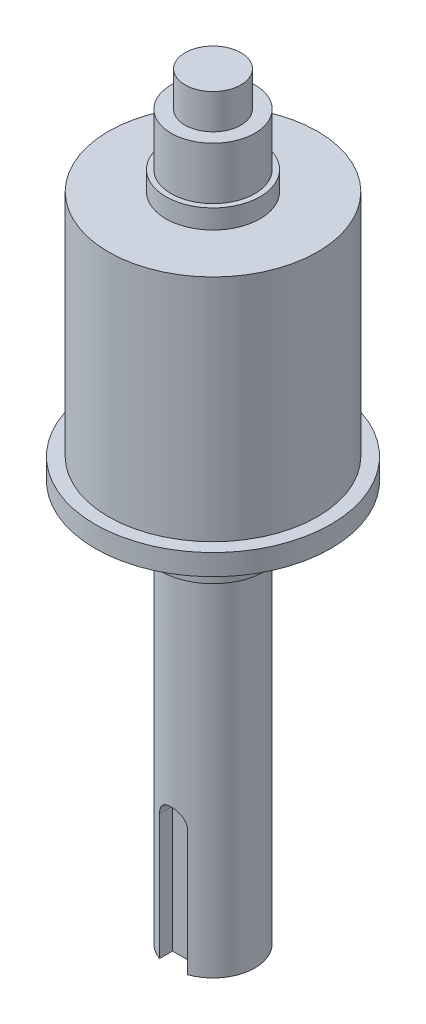
ISO-10303-21;
HEADER;
FILE_DESCRIPTION(('STEP AP214'),'2;1');
FILE_NAME('part.step','',(''),(''),'','','');
FILE_SCHEMA(('AUTOMOTIVE_DESIGN { 1 0 10303 214 1 1 1 1 }'));
ENDSEC;
DATA;
#1=APPLICATION_CONTEXT('core data for automotive mechanical design processes');
#2=APPLICATION_PROTOCOL_DEFINITION('international standard','automotive_design',2000,#1);
#3=PRODUCT_CONTEXT('',#1,'mechanical');
#4=PRODUCT('Part','Part','',(#3));
#5=PRODUCT_RELATED_PRODUCT_CATEGORY('part','',(#4));
#6=PRODUCT_DEFINITION_FORMATION('','',#4);
#7=PRODUCT_DEFINITION_CONTEXT('part definition',#1,'design');
#8=PRODUCT_DEFINITION('design','',#6,#7);
#9=PRODUCT_DEFINITION_SHAPE('','',#8);
#10=(LENGTH_UNIT() NAMED_UNIT(*) SI_UNIT(.MILLI.,.METRE.));
#11=(NAMED_UNIT(*) PLANE_ANGLE_UNIT() SI_UNIT($,.RADIAN.));
#12=(NAMED_UNIT(*) SI_UNIT($,.STERADIAN.) SOLID_ANGLE_UNIT());
#13=UNCERTAINTY_MEASURE_WITH_UNIT(LENGTH_MEASURE(1.E-05),#10,'distance_accuracy_value','');
#14=(GEOMETRIC_REPRESENTATION_CONTEXT(3) GLOBAL_UNCERTAINTY_ASSIGNED_CONTEXT((#13)) GLOBAL_UNIT_ASSIGNED_CONTEXT((#10,
#11,#12)) REPRESENTATION_CONTEXT('',''));
#15=CARTESIAN_POINT('',(0.,0.,0.));
#16=DIRECTION('',(0.,0.,1.));
#17=DIRECTION('',(1.,0.,0.));
#18=AXIS2_PLACEMENT_3D('',#15,#16,#17);
#19=CARTESIAN_POINT('',(0.,40.0334496894889,0.));
#20=DIRECTION('',(0.,1.,0.));
#21=DIRECTION('',(0.,0.,1.));
#22=AXIS2_PLACEMENT_3D('',#19,#20,#21);
#23=CYLINDRICAL_SURFACE('',#22,6.);
#24=CARTESIAN_POINT('',(0.,-58.61,0.));
#25=DIRECTION('',(0.,1.,0.));
#26=DIRECTION('',(0.,0.,1.));
#27=AXIS2_PLACEMENT_3D('',#24,#25,#26);
#28=CIRCLE('',#27,6.);
#29=CARTESIAN_POINT('',(0.,-58.61,6.));
#30=VERTEX_POINT('',#29);
#31=EDGE_CURVE('E119',#30,#30,#28,.T.);
#32=ORIENTED_EDGE('',*,*,#31,.F.);
#33=EDGE_LOOP('',(#32));
#34=FACE_BOUND('',#33,.T.);
#35=CARTESIAN_POINT('',(-2.,-90.61,5.65685424949238));
#36=CARTESIAN_POINT('',(-2.0000014949184,-90.5554190063978,5.65684884188677));
#37=CARTESIAN_POINT('',(-1.99776424917478,-90.5008658756214,5.6576451988649));
#38=CARTESIAN_POINT('',(-1.9888512140728,-90.3921828318902,5.66078654578441));
#39=CARTESIAN_POINT('',(-1.98217662286705,-90.3380528086806,5.66313111768244));
#40=CARTESIAN_POINT('',(-1.95562135046158,-90.1772157136097,5.67238184449301));
#41=CARTESIAN_POINT('',(-1.92920846605623,-90.0716383074591,5.6815058499903));
#42=CARTESIAN_POINT('',(-1.85991682366086,-89.8667496151125,5.70456149397718));
#43=CARTESIAN_POINT('',(-1.81704715197507,-89.7674349062542,5.71849047905858));
#44=CARTESIAN_POINT('',(-1.71614645792974,-89.5773203319891,5.74957574438921));
#45=CARTESIAN_POINT('',(-1.65810612564547,-89.4865257418653,5.76673400456216));
#46=CARTESIAN_POINT('',(-1.52610278704603,-89.3125595373509,5.80308960804095));
#47=CARTESIAN_POINT('',(-1.45164996064407,-89.2297702390748,5.82233755536617));
#48=CARTESIAN_POINT('',(-1.28997688598297,-89.0775879644166,5.86027697385955));
#49=CARTESIAN_POINT('',(-1.20275436910907,-89.0081973734881,5.87896834543705));
#50=CARTESIAN_POINT('',(-1.01520729191253,-88.8830409623916,5.91427765988454));
#51=CARTESIAN_POINT('',(-0.914600178716996,-88.8276780311955,5.93082875123707));
#52=CARTESIAN_POINT('',(-0.704858499931721,-88.7348154966255,5.95939217209316));
#53=CARTESIAN_POINT('',(-0.595726551186841,-88.6973104363591,5.97140588786619));
#54=CARTESIAN_POINT('',(-0.376058690956074,-88.6425285478173,5.98918142285845));
#55=CARTESIAN_POINT('',(-0.265703668920225,-88.6245934548926,5.99514617977146));
#56=CARTESIAN_POINT('',(-0.0433979389113498,-88.6073674029488,6.00087216807633));
#57=CARTESIAN_POINT('',(0.0685523824907803,-88.6080720014605,6.00063487762604));
#58=CARTESIAN_POINT('',(0.286207690558779,-88.6276885662133,5.99412077270531));
#59=CARTESIAN_POINT('',(0.391985405251067,-88.6458852759189,5.98808121982527));
#60=CARTESIAN_POINT('',(0.598888128753307,-88.6987863973482,5.97093921001647));
#61=CARTESIAN_POINT('',(0.700012879232924,-88.7334917244125,5.95983647235462));
#62=CARTESIAN_POINT('',(0.89630524606192,-88.8188427392013,5.93351336542608));
#63=CARTESIAN_POINT('',(0.991377011307978,-88.8696920902447,5.91824075676625));
#64=CARTESIAN_POINT('',(1.17184917819497,-88.9857199027814,5.88516775360088));
#65=CARTESIAN_POINT('',(1.25724693942937,-89.050902262093,5.86736667195186));
#66=CARTESIAN_POINT('',(1.42019467942242,-89.1973420999937,5.83012543885479));
#67=CARTESIAN_POINT('',(1.49718722322539,-89.2792110872194,5.81064757359828));
#68=CARTESIAN_POINT('',(1.63654404964076,-89.4548829794323,5.77294980945702));
#69=CARTESIAN_POINT('',(1.69890360636762,-89.5486897248065,5.75473031831506));
#70=CARTESIAN_POINT('',(1.80800665118557,-89.7473603567066,5.72140062752635));
#71=CARTESIAN_POINT('',(1.85450601901537,-89.8523670298659,5.70634029896469));
#72=CARTESIAN_POINT('',(1.92892046140224,-90.0692939551799,5.68162194124078));
#73=CARTESIAN_POINT('',(1.95686487211071,-90.1812029867443,5.67195538817985));
#74=CARTESIAN_POINT('',(1.98331631256166,-90.346837273496,5.6627308418944));
#75=CARTESIAN_POINT('',(1.98957012251023,-90.3992827797084,5.66053335389203));
#76=CARTESIAN_POINT('',(1.99790923214239,-90.5044761567996,5.65759407142798));
#77=CARTESIAN_POINT('',(1.99999991078996,-90.5572235490888,5.65685039859056));
#78=CARTESIAN_POINT('',(2.,-90.61,5.65685424949238));
#79=B_SPLINE_CURVE_WITH_KNOTS('',3,(#35,#36,#37,#38,#39,#40,#41,#42,#43,#44,#45,#46,#47,#48,#49,
#50,#51,#52,#53,#54,#55,#56,#57,#58,#59,#60,#61,#62,#63,#64,#65,#66,#67,#68,#69,#70,#71,#72,#73,
#74,#75,#76,#77,#78),.UNSPECIFIED.,.F.,.F.,(4,2,2,2,2,2,2,2,2,2,2,2,2,2,2,2,2,2,2,2,2,4),(0.,
0.163636969470853,0.327229772338919,0.653162396790742,0.978915321932481,1.30486862627062,
1.64233009925354,1.97985159727494,2.32618265866202,2.67240782242254,3.00658941454805,
3.34069136061284,3.66168836931469,3.98270317816495,4.30794037651934,4.63326613177536,
4.97388108116099,5.31460588498485,5.66036059856081,6.00556734973678,6.163997906655,
6.32222363058113),.UNSPECIFIED.);
#80=CARTESIAN_POINT('',(-2.,-90.61,5.65685424949238));
#81=VERTEX_POINT('',#80);
#82=CARTESIAN_POINT('',(2.,-90.61,5.65685424949238));
#83=VERTEX_POINT('',#82);
#84=EDGE_CURVE('E11',#81,#83,#79,.T.);
#85=ORIENTED_EDGE('',*,*,#84,.T.);
#86=DIRECTION('',(0.,-1.,0.));
#87=VECTOR('',#86,1.);
#88=CARTESIAN_POINT('',(2.,-93.61,5.65685424949237));
#89=LINE('',#88,#87);
#90=CARTESIAN_POINT('',(2.,-108.61,5.65685424949237));
#91=VERTEX_POINT('',#90);
#92=EDGE_CURVE('E94',#83,#91,#89,.T.);
#93=ORIENTED_EDGE('',*,*,#92,.T.);
#94=CARTESIAN_POINT('',(0.,-108.61,0.));
#95=DIRECTION('',(0.,1.,0.));
#96=DIRECTION('',(0.,0.,1.));
#97=AXIS2_PLACEMENT_3D('',#94,#95,#96);
#98=CIRCLE('',#97,5.99999999999999);
#99=CARTESIAN_POINT('',(-2.,-108.61,5.65685424949237));
#100=VERTEX_POINT('',#99);
#101=EDGE_CURVE('E113',#91,#100,#98,.T.);
#102=ORIENTED_EDGE('',*,*,#101,.T.);
#103=DIRECTION('',(0.,-1.,0.));
#104=VECTOR('',#103,1.);
#105=CARTESIAN_POINT('',(-2.,-93.61,5.65685424949237));
#106=LINE('',#105,#104);
#107=EDGE_CURVE('E60',#81,#100,#106,.T.);
#108=ORIENTED_EDGE('',*,*,#107,.F.);
#109=EDGE_LOOP('',(#85,#93,#102,#108));
#110=FACE_BOUND('',#109,.T.);
#111=ADVANCED_FACE('F39',(#34,#110),#23,.T.);
#112=CARTESIAN_POINT('',(0.,0.,0.));
#113=DIRECTION('',(0.,1.,0.));
#114=DIRECTION('',(0.,0.,1.));
#115=AXIS2_PLACEMENT_3D('',#112,#113,#114);
#116=PLANE('',#115);
#117=CARTESIAN_POINT('',(0.,0.,0.));
#118=DIRECTION('',(0.,1.,0.));
#119=DIRECTION('',(0.,0.,1.));
#120=AXIS2_PLACEMENT_3D('',#117,#118,#119);
#121=CIRCLE('',#120,4.);
#122=CARTESIAN_POINT('',(0.,0.,4.));
#123=VERTEX_POINT('',#122);
#124=EDGE_CURVE('E53',#123,#123,#121,.T.);
#125=ORIENTED_EDGE('',*,*,#124,.T.);
#126=EDGE_LOOP('',(#125));
#127=FACE_BOUND('',#126,.T.);
#128=ADVANCED_FACE('F41',(#127),#116,.T.);
#129=CARTESIAN_POINT('',(0.,40.0334496894889,0.));
#130=DIRECTION('',(0.,1.,0.));
#131=DIRECTION('',(0.,0.,1.));
#132=AXIS2_PLACEMENT_3D('',#129,#130,#131);
#133=CYLINDRICAL_SURFACE('',#132,4.);
#134=CARTESIAN_POINT('',(0.,-5.,0.));
#135=DIRECTION('',(0.,1.,0.));
#136=DIRECTION('',(0.,0.,1.));
#137=AXIS2_PLACEMENT_3D('',#134,#135,#136);
#138=CIRCLE('',#137,4.);
#139=CARTESIAN_POINT('',(0.,-5.,4.));
#140=VERTEX_POINT('',#139);
#141=EDGE_CURVE('E158',#140,#140,#138,.T.);
#142=ORIENTED_EDGE('',*,*,#141,.T.);
#143=EDGE_LOOP('',(#142));
#144=FACE_BOUND('',#143,.T.);
#145=ORIENTED_EDGE('',*,*,#124,.F.);
#146=EDGE_LOOP('',(#145));
#147=FACE_BOUND('',#146,.T.);
#148=ADVANCED_FACE('F164',(#144,#147),#133,.T.);
#149=CARTESIAN_POINT('',(-4.,-5.,0.));
#150=DIRECTION('',(0.,1.,0.));
#151=DIRECTION('',(0.,0.,1.));
#152=AXIS2_PLACEMENT_3D('',#149,#150,#151);
#153=PLANE('',#152);
#154=CARTESIAN_POINT('',(0.,-5.,0.));
#155=DIRECTION('',(0.,1.,0.));
#156=DIRECTION('',(0.,0.,1.));
#157=AXIS2_PLACEMENT_3D('',#154,#155,#156);
#158=CIRCLE('',#157,6.);
#159=CARTESIAN_POINT('',(0.,-5.,6.));
#160=VERTEX_POINT('',#159);
#161=EDGE_CURVE('E155',#160,#160,#158,.T.);
#162=ORIENTED_EDGE('',*,*,#161,.T.);
#163=EDGE_LOOP('',(#162));
#164=FACE_BOUND('',#163,.T.);
#165=ORIENTED_EDGE('',*,*,#141,.F.);
#166=EDGE_LOOP('',(#165));
#167=FACE_BOUND('',#166,.T.);
#168=ADVANCED_FACE('F166',(#164,#167),#153,.T.);
#169=CARTESIAN_POINT('',(0.,40.0334496894889,0.));
#170=DIRECTION('',(0.,1.,0.));
#171=DIRECTION('',(0.,0.,1.));
#172=AXIS2_PLACEMENT_3D('',#169,#170,#171);
#173=CYLINDRICAL_SURFACE('',#172,6.);
#174=CARTESIAN_POINT('',(0.,-12.5,0.));
#175=DIRECTION('',(0.,1.,0.));
#176=DIRECTION('',(0.,0.,1.));
#177=AXIS2_PLACEMENT_3D('',#174,#175,#176);
#178=CIRCLE('',#177,6.);
#179=CARTESIAN_POINT('',(0.,-12.5,6.));
#180=VERTEX_POINT('',#179);
#181=EDGE_CURVE('E152',#180,#180,#178,.T.);
#182=ORIENTED_EDGE('',*,*,#181,.T.);
#183=EDGE_LOOP('',(#182));
#184=FACE_BOUND('',#183,.T.);
#185=ORIENTED_EDGE('',*,*,#161,.F.);
#186=EDGE_LOOP('',(#185));
#187=FACE_BOUND('',#186,.T.);
#188=ADVANCED_FACE('F172',(#184,#187),#173,.T.);
#189=CARTESIAN_POINT('',(-6.,-12.5,0.));
#190=DIRECTION('',(0.,1.,0.));
#191=DIRECTION('',(0.,0.,1.));
#192=AXIS2_PLACEMENT_3D('',#189,#190,#191);
#193=PLANE('',#192);
#194=CARTESIAN_POINT('',(0.,-12.5,0.));
#195=DIRECTION('',(0.,1.,0.));
#196=DIRECTION('',(0.,0.,1.));
#197=AXIS2_PLACEMENT_3D('',#194,#195,#196);
#198=CIRCLE('',#197,6.75);
#199=CARTESIAN_POINT('',(0.,-12.5,6.75));
#200=VERTEX_POINT('',#199);
#201=EDGE_CURVE('E149',#200,#200,#198,.T.);
#202=ORIENTED_EDGE('',*,*,#201,.T.);
#203=EDGE_LOOP('',(#202));
#204=FACE_BOUND('',#203,.T.);
#205=ORIENTED_EDGE('',*,*,#181,.F.);
#206=EDGE_LOOP('',(#205));
#207=FACE_BOUND('',#206,.T.);
#208=ADVANCED_FACE('F225',(#204,#207),#193,.T.);
#209=CARTESIAN_POINT('',(0.,40.0334496894889,0.));
#210=DIRECTION('',(0.,1.,0.));
#211=DIRECTION('',(0.,0.,1.));
#212=AXIS2_PLACEMENT_3D('',#209,#210,#211);
#213=CYLINDRICAL_SURFACE('',#212,6.75);
#214=CARTESIAN_POINT('',(0.,-15.25,0.));
#215=DIRECTION('',(0.,1.,0.));
#216=DIRECTION('',(0.,0.,1.));
#217=AXIS2_PLACEMENT_3D('',#214,#215,#216);
#218=CIRCLE('',#217,6.75);
#219=CARTESIAN_POINT('',(0.,-15.25,6.75));
#220=VERTEX_POINT('',#219);
#221=EDGE_CURVE('E146',#220,#220,#218,.T.);
#222=ORIENTED_EDGE('',*,*,#221,.T.);
#223=EDGE_LOOP('',(#222));
#224=FACE_BOUND('',#223,.T.);
#225=ORIENTED_EDGE('',*,*,#201,.F.);
#226=EDGE_LOOP('',(#225));
#227=FACE_BOUND('',#226,.T.);
#228=ADVANCED_FACE('F221',(#224,#227),#213,.T.);
#229=CARTESIAN_POINT('',(-6.75,-15.25,0.));
#230=DIRECTION('',(0.,1.,0.));
#231=DIRECTION('',(0.,0.,1.));
#232=AXIS2_PLACEMENT_3D('',#229,#230,#231);
#233=PLANE('',#232);
#234=CARTESIAN_POINT('',(0.,-15.25,0.));
#235=DIRECTION('',(0.,1.,0.));
#236=DIRECTION('',(0.,0.,1.));
#237=AXIS2_PLACEMENT_3D('',#234,#235,#236);
#238=CIRCLE('',#237,14.9815);
#239=CARTESIAN_POINT('',(0.,-15.25,14.9815));
#240=VERTEX_POINT('',#239);
#241=EDGE_CURVE('E143',#240,#240,#238,.T.);
#242=ORIENTED_EDGE('',*,*,#241,.T.);
#243=EDGE_LOOP('',(#242));
#244=FACE_BOUND('',#243,.T.);
#245=ORIENTED_EDGE('',*,*,#221,.F.);
#246=EDGE_LOOP('',(#245));
#247=FACE_BOUND('',#246,.T.);
#248=ADVANCED_FACE('F217',(#244,#247),#233,.T.);
#249=CARTESIAN_POINT('',(0.,40.0334496894889,0.));
#250=DIRECTION('',(0.,1.,0.));
#251=DIRECTION('',(0.,0.,1.));
#252=AXIS2_PLACEMENT_3D('',#249,#250,#251);
#253=CYLINDRICAL_SURFACE('',#252,14.9815);
#254=CARTESIAN_POINT('',(0.,-48.11,0.));
#255=DIRECTION('',(0.,1.,0.));
#256=DIRECTION('',(0.,0.,1.));
#257=AXIS2_PLACEMENT_3D('',#254,#255,#256);
#258=CIRCLE('',#257,14.9815);
#259=CARTESIAN_POINT('',(0.,-48.11,14.9815));
#260=VERTEX_POINT('',#259);
#261=EDGE_CURVE('E140',#260,#260,#258,.T.);
#262=ORIENTED_EDGE('',*,*,#261,.T.);
#263=EDGE_LOOP('',(#262));
#264=FACE_BOUND('',#263,.T.);
#265=ORIENTED_EDGE('',*,*,#241,.F.);
#266=EDGE_LOOP('',(#265));
#267=FACE_BOUND('',#266,.T.);
#268=ADVANCED_FACE('F213',(#264,#267),#253,.T.);
#269=CARTESIAN_POINT('',(-16.8815,-48.11,0.));
#270=DIRECTION('',(0.,1.,0.));
#271=DIRECTION('',(0.,0.,1.));
#272=AXIS2_PLACEMENT_3D('',#269,#270,#271);
#273=PLANE('',#272);
#274=CARTESIAN_POINT('',(0.,-48.11,0.));
#275=DIRECTION('',(0.,1.,0.));
#276=DIRECTION('',(0.,0.,1.));
#277=AXIS2_PLACEMENT_3D('',#274,#275,#276);
#278=CIRCLE('',#277,16.8815);
#279=CARTESIAN_POINT('',(0.,-48.11,16.8815));
#280=VERTEX_POINT('',#279);
#281=EDGE_CURVE('E137',#280,#280,#278,.T.);
#282=ORIENTED_EDGE('',*,*,#281,.T.);
#283=EDGE_LOOP('',(#282));
#284=FACE_BOUND('',#283,.T.);
#285=ORIENTED_EDGE('',*,*,#261,.F.);
#286=EDGE_LOOP('',(#285));
#287=FACE_BOUND('',#286,.T.);
#288=ADVANCED_FACE('F209',(#284,#287),#273,.T.);
#289=CARTESIAN_POINT('',(0.,40.0334496894889,0.));
#290=DIRECTION('',(0.,1.,0.));
#291=DIRECTION('',(0.,0.,1.));
#292=AXIS2_PLACEMENT_3D('',#289,#290,#291);
#293=CYLINDRICAL_SURFACE('',#292,16.8815);
#294=CARTESIAN_POINT('',(0.,-51.11,0.));
#295=DIRECTION('',(0.,1.,0.));
#296=DIRECTION('',(0.,0.,1.));
#297=AXIS2_PLACEMENT_3D('',#294,#295,#296);
#298=CIRCLE('',#297,16.8815);
#299=CARTESIAN_POINT('',(0.,-51.11,16.8815));
#300=VERTEX_POINT('',#299);
#301=EDGE_CURVE('E134',#300,#300,#298,.T.);
#302=ORIENTED_EDGE('',*,*,#301,.T.);
#303=EDGE_LOOP('',(#302));
#304=FACE_BOUND('',#303,.T.);
#305=ORIENTED_EDGE('',*,*,#281,.F.);
#306=EDGE_LOOP('',(#305));
#307=FACE_BOUND('',#306,.T.);
#308=ADVANCED_FACE('F205',(#304,#307),#293,.T.);
#309=CARTESIAN_POINT('',(-16.8815,-51.11,0.));
#310=DIRECTION('',(0.,-1.,0.));
#311=DIRECTION('',(0.,0.,-1.));
#312=AXIS2_PLACEMENT_3D('',#309,#310,#311);
#313=PLANE('',#312);
#314=CARTESIAN_POINT('',(0.,-51.11,0.));
#315=DIRECTION('',(0.,1.,0.));
#316=DIRECTION('',(0.,0.,1.));
#317=AXIS2_PLACEMENT_3D('',#314,#315,#316);
#318=CIRCLE('',#317,8.25);
#319=CARTESIAN_POINT('',(0.,-51.11,8.25));
#320=VERTEX_POINT('',#319);
#321=EDGE_CURVE('E131',#320,#320,#318,.T.);
#322=ORIENTED_EDGE('',*,*,#321,.T.);
#323=EDGE_LOOP('',(#322));
#324=FACE_BOUND('',#323,.T.);
#325=ORIENTED_EDGE('',*,*,#301,.F.);
#326=EDGE_LOOP('',(#325));
#327=FACE_BOUND('',#326,.T.);
#328=ADVANCED_FACE('F201',(#324,#327),#313,.T.);
#329=CARTESIAN_POINT('',(0.,40.0334496894889,0.));
#330=DIRECTION('',(0.,1.,0.));
#331=DIRECTION('',(0.,0.,1.));
#332=AXIS2_PLACEMENT_3D('',#329,#330,#331);
#333=CYLINDRICAL_SURFACE('',#332,8.25);
#334=CARTESIAN_POINT('',(0.,-53.61,0.));
#335=DIRECTION('',(0.,1.,0.));
#336=DIRECTION('',(0.,0.,1.));
#337=AXIS2_PLACEMENT_3D('',#334,#335,#336);
#338=CIRCLE('',#337,8.25);
#339=CARTESIAN_POINT('',(0.,-53.61,8.25));
#340=VERTEX_POINT('',#339);
#341=EDGE_CURVE('E128',#340,#340,#338,.T.);
#342=ORIENTED_EDGE('',*,*,#341,.T.);
#343=EDGE_LOOP('',(#342));
#344=FACE_BOUND('',#343,.T.);
#345=ORIENTED_EDGE('',*,*,#321,.F.);
#346=EDGE_LOOP('',(#345));
#347=FACE_BOUND('',#346,.T.);
#348=ADVANCED_FACE('F197',(#344,#347),#333,.T.);
#349=CARTESIAN_POINT('',(-8.25,-53.61,0.));
#350=DIRECTION('',(0.,-1.,0.));
#351=DIRECTION('',(0.,0.,-1.));
#352=AXIS2_PLACEMENT_3D('',#349,#350,#351);
#353=PLANE('',#352);
#354=CARTESIAN_POINT('',(0.,-53.61,0.));
#355=DIRECTION('',(0.,1.,0.));
#356=DIRECTION('',(0.,0.,1.));
#357=AXIS2_PLACEMENT_3D('',#354,#355,#356);
#358=CIRCLE('',#357,7.5);
#359=CARTESIAN_POINT('',(0.,-53.61,7.5));
#360=VERTEX_POINT('',#359);
#361=EDGE_CURVE('E125',#360,#360,#358,.T.);
#362=ORIENTED_EDGE('',*,*,#361,.T.);
#363=EDGE_LOOP('',(#362));
#364=FACE_BOUND('',#363,.T.);
#365=ORIENTED_EDGE('',*,*,#341,.F.);
#366=EDGE_LOOP('',(#365));
#367=FACE_BOUND('',#366,.T.);
#368=ADVANCED_FACE('F193',(#364,#367),#353,.T.);
#369=CARTESIAN_POINT('',(0.,40.0334496894889,0.));
#370=DIRECTION('',(0.,1.,0.));
#371=DIRECTION('',(0.,0.,1.));
#372=AXIS2_PLACEMENT_3D('',#369,#370,#371);
#373=CYLINDRICAL_SURFACE('',#372,7.5);
#374=CARTESIAN_POINT('',(0.,-58.61,0.));
#375=DIRECTION('',(0.,1.,0.));
#376=DIRECTION('',(0.,0.,1.));
#377=AXIS2_PLACEMENT_3D('',#374,#375,#376);
#378=CIRCLE('',#377,7.5);
#379=CARTESIAN_POINT('',(0.,-58.61,7.5));
#380=VERTEX_POINT('',#379);
#381=EDGE_CURVE('E122',#380,#380,#378,.T.);
#382=ORIENTED_EDGE('',*,*,#381,.T.);
#383=EDGE_LOOP('',(#382));
#384=FACE_BOUND('',#383,.T.);
#385=ORIENTED_EDGE('',*,*,#361,.F.);
#386=EDGE_LOOP('',(#385));
#387=FACE_BOUND('',#386,.T.);
#388=ADVANCED_FACE('F189',(#384,#387),#373,.T.);
#389=CARTESIAN_POINT('',(-7.5,-58.61,0.));
#390=DIRECTION('',(0.,-1.,0.));
#391=DIRECTION('',(0.,0.,-1.));
#392=AXIS2_PLACEMENT_3D('',#389,#390,#391);
#393=PLANE('',#392);
#394=ORIENTED_EDGE('',*,*,#31,.T.);
#395=EDGE_LOOP('',(#394));
#396=FACE_BOUND('',#395,.T.);
#397=ORIENTED_EDGE('',*,*,#381,.F.);
#398=EDGE_LOOP('',(#397));
#399=FACE_BOUND('',#398,.T.);
#400=ADVANCED_FACE('F186',(#396,#399),#393,.T.);
#401=CARTESIAN_POINT('',(-5.99999999999999,-108.61,0.));
#402=DIRECTION('',(0.,-1.,0.));
#403=DIRECTION('',(0.,0.,-1.));
#404=AXIS2_PLACEMENT_3D('',#401,#402,#403);
#405=PLANE('',#404);
#406=DIRECTION('',(0.,0.,1.));
#407=VECTOR('',#406,1.);
#408=CARTESIAN_POINT('',(2.,-108.61,3.80000000000001));
#409=LINE('',#408,#407);
#410=CARTESIAN_POINT('',(2.,-108.61,3.80000000000001));
#411=VERTEX_POINT('',#410);
#412=EDGE_CURVE('E68',#411,#91,#409,.T.);
#413=ORIENTED_EDGE('',*,*,#412,.F.);
#414=DIRECTION('',(1.,0.,0.));
#415=VECTOR('',#414,1.);
#416=CARTESIAN_POINT('',(-2.,-108.61,3.80000000000001));
#417=LINE('',#416,#415);
#418=CARTESIAN_POINT('',(-2.,-108.61,3.80000000000001));
#419=VERTEX_POINT('',#418);
#420=EDGE_CURVE('E93',#419,#411,#417,.T.);
#421=ORIENTED_EDGE('',*,*,#420,.F.);
#422=DIRECTION('',(0.,0.,-1.));
#423=VECTOR('',#422,1.);
#424=CARTESIAN_POINT('',(-2.,-108.61,5.65685424949237));
#425=LINE('',#424,#423);
#426=EDGE_CURVE('E102',#100,#419,#425,.T.);
#427=ORIENTED_EDGE('',*,*,#426,.F.);
#428=ORIENTED_EDGE('',*,*,#101,.F.);
#429=EDGE_LOOP('',(#413,#421,#427,#428));
#430=FACE_BOUND('',#429,.T.);
#431=ADVANCED_FACE('F184',(#430),#405,.T.);
#432=CARTESIAN_POINT('',(2.,-93.61,3.80000000000001));
#433=DIRECTION('',(1.,0.,0.));
#434=DIRECTION('',(0.,0.,-1.));
#435=AXIS2_PLACEMENT_3D('',#432,#433,#434);
#436=PLANE('',#435);
#437=ORIENTED_EDGE('',*,*,#412,.T.);
#438=ORIENTED_EDGE('',*,*,#92,.F.);
#439=DIRECTION('',(0.,0.,-1.));
#440=VECTOR('',#439,1.);
#441=CARTESIAN_POINT('',(2.,-90.61,16.8815));
#442=LINE('',#441,#440);
#443=CARTESIAN_POINT('',(2.,-90.61,3.80000000000001));
#444=VERTEX_POINT('',#443);
#445=EDGE_CURVE('E98',#83,#444,#442,.T.);
#446=ORIENTED_EDGE('',*,*,#445,.T.);
#447=DIRECTION('',(0.,-1.,0.));
#448=VECTOR('',#447,1.);
#449=CARTESIAN_POINT('',(2.,-93.61,3.80000000000001));
#450=LINE('',#449,#448);
#451=EDGE_CURVE('E87',#444,#411,#450,.T.);
#452=ORIENTED_EDGE('',*,*,#451,.T.);
#453=EDGE_LOOP('',(#437,#438,#446,#452));
#454=FACE_BOUND('',#453,.T.);
#455=ADVANCED_FACE('F99',(#454),#436,.F.);
#456=CARTESIAN_POINT('',(-2.,-93.61,3.80000000000001));
#457=DIRECTION('',(0.,0.,-1.));
#458=DIRECTION('',(-1.,0.,0.));
#459=AXIS2_PLACEMENT_3D('',#456,#457,#458);
#460=PLANE('',#459);
#461=ORIENTED_EDGE('',*,*,#420,.T.);
#462=ORIENTED_EDGE('',*,*,#451,.F.);
#463=CARTESIAN_POINT('',(0.,-90.61,3.80000000000001));
#464=DIRECTION('',(0.,0.,1.));
#465=DIRECTION('',(-1.,0.,0.));
#466=AXIS2_PLACEMENT_3D('',#463,#464,#465);
#467=CIRCLE('',#466,2.);
#468=CARTESIAN_POINT('',(-2.,-90.61,3.80000000000001));
#469=VERTEX_POINT('',#468);
#470=EDGE_CURVE('E91',#444,#469,#467,.T.);
#471=ORIENTED_EDGE('',*,*,#470,.T.);
#472=DIRECTION('',(0.,-1.,0.));
#473=VECTOR('',#472,1.);
#474=CARTESIAN_POINT('',(-2.,-93.61,3.80000000000001));
#475=LINE('',#474,#473);
#476=EDGE_CURVE('E95',#469,#419,#475,.T.);
#477=ORIENTED_EDGE('',*,*,#476,.T.);
#478=EDGE_LOOP('',(#461,#462,#471,#477));
#479=FACE_BOUND('',#478,.T.);
#480=ADVANCED_FACE('F89',(#479),#460,.F.);
#481=CARTESIAN_POINT('',(-2.,-93.61,5.65685424949237));
#482=DIRECTION('',(-1.,0.,0.));
#483=DIRECTION('',(0.,0.,1.));
#484=AXIS2_PLACEMENT_3D('',#481,#482,#483);
#485=PLANE('',#484);
#486=ORIENTED_EDGE('',*,*,#426,.T.);
#487=ORIENTED_EDGE('',*,*,#476,.F.);
#488=DIRECTION('',(0.,0.,-1.));
#489=VECTOR('',#488,1.);
#490=CARTESIAN_POINT('',(-2.,-90.61,16.8815));
#491=LINE('',#490,#489);
#492=EDGE_CURVE('E103',#81,#469,#491,.T.);
#493=ORIENTED_EDGE('',*,*,#492,.F.);
#494=ORIENTED_EDGE('',*,*,#107,.T.);
#495=EDGE_LOOP('',(#486,#487,#493,#494));
#496=FACE_BOUND('',#495,.T.);
#497=ADVANCED_FACE('F304',(#496),#485,.F.);
#498=CARTESIAN_POINT('',(0.,-90.61,16.8815));
#499=DIRECTION('',(0.,0.,-1.));
#500=DIRECTION('',(-1.,0.,0.));
#501=AXIS2_PLACEMENT_3D('',#498,#499,#500);
#502=CYLINDRICAL_SURFACE('',#501,2.);
#503=ORIENTED_EDGE('',*,*,#492,.T.);
#504=ORIENTED_EDGE('',*,*,#470,.F.);
#505=ORIENTED_EDGE('',*,*,#445,.F.);
#506=ORIENTED_EDGE('',*,*,#84,.F.);
#507=EDGE_LOOP('',(#503,#504,#505,#506));
#508=FACE_BOUND('',#507,.T.);
#509=ADVANCED_FACE('F106',(#508),#502,.F.);
#510=CLOSED_SHELL('',(#111,#128,#148,#168,#188,#208,#228,#248,#268,#288,#308,#328,#348,#368,
#388,#400,#431,#455,#480,#497,#509));
#511=MANIFOLD_SOLID_BREP('B2',#510);
#512=ADVANCED_BREP_SHAPE_REPRESENTATION('',(#18,#511),#14);
#513=SHAPE_DEFINITION_REPRESENTATION(#9,#512);
ENDSEC;
END-ISO-10303-21;
